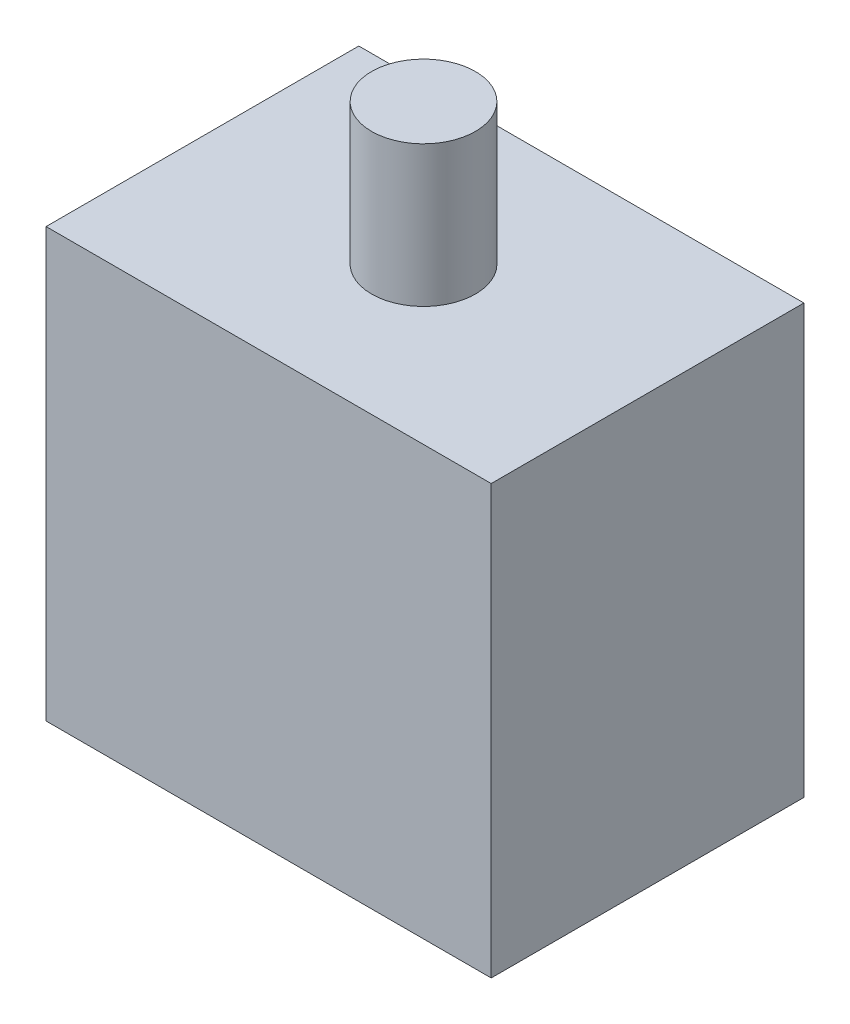
ISO-10303-21;
HEADER;
FILE_DESCRIPTION(('STEP AP214'),'2;1');
FILE_NAME('part.step','',(''),(''),'','','');
FILE_SCHEMA(('AUTOMOTIVE_DESIGN { 1 0 10303 214 1 1 1 1 }'));
ENDSEC;
DATA;
#1=APPLICATION_CONTEXT('core data for automotive mechanical design processes');
#2=APPLICATION_PROTOCOL_DEFINITION('international standard','automotive_design',2000,#1);
#3=PRODUCT_CONTEXT('',#1,'mechanical');
#4=PRODUCT('Part','Part','',(#3));
#5=PRODUCT_RELATED_PRODUCT_CATEGORY('part','',(#4));
#6=PRODUCT_DEFINITION_FORMATION('','',#4);
#7=PRODUCT_DEFINITION_CONTEXT('part definition',#1,'design');
#8=PRODUCT_DEFINITION('design','',#6,#7);
#9=PRODUCT_DEFINITION_SHAPE('','',#8);
#10=(LENGTH_UNIT() NAMED_UNIT(*) SI_UNIT(.MILLI.,.METRE.));
#11=(NAMED_UNIT(*) PLANE_ANGLE_UNIT() SI_UNIT($,.RADIAN.));
#12=(NAMED_UNIT(*) SI_UNIT($,.STERADIAN.) SOLID_ANGLE_UNIT());
#13=UNCERTAINTY_MEASURE_WITH_UNIT(LENGTH_MEASURE(1.E-05),#10,'distance_accuracy_value','');
#14=(GEOMETRIC_REPRESENTATION_CONTEXT(3) GLOBAL_UNCERTAINTY_ASSIGNED_CONTEXT((#13)) GLOBAL_UNIT_ASSIGNED_CONTEXT((#10,
#11,#12)) REPRESENTATION_CONTEXT('',''));
#15=CARTESIAN_POINT('',(0.,0.,0.));
#16=DIRECTION('',(0.,0.,1.));
#17=DIRECTION('',(1.,0.,0.));
#18=AXIS2_PLACEMENT_3D('',#15,#16,#17);
#19=CARTESIAN_POINT('',(0.,77.216,0.));
#20=DIRECTION('',(-1.,0.,0.));
#21=DIRECTION('',(0.,0.,1.));
#22=AXIS2_PLACEMENT_3D('',#19,#20,#21);
#23=PLANE('',#22);
#24=DIRECTION('',(0.,0.,-1.));
#25=VECTOR('',#24,1.);
#26=CARTESIAN_POINT('',(0.,0.,0.));
#27=LINE('',#26,#25);
#28=CARTESIAN_POINT('',(0.,0.,0.));
#29=VERTEX_POINT('',#28);
#30=CARTESIAN_POINT('',(0.,0.,-56.388));
#31=VERTEX_POINT('',#30);
#32=EDGE_CURVE('E110',#29,#31,#27,.T.);
#33=ORIENTED_EDGE('',*,*,#32,.T.);
#34=DIRECTION('',(0.,-1.,0.));
#35=VECTOR('',#34,1.);
#36=CARTESIAN_POINT('',(0.,77.216,-56.388));
#37=LINE('',#36,#35);
#38=CARTESIAN_POINT('',(0.,77.216,-56.388));
#39=VERTEX_POINT('',#38);
#40=EDGE_CURVE('E42',#39,#31,#37,.T.);
#41=ORIENTED_EDGE('',*,*,#40,.F.);
#42=DIRECTION('',(0.,0.,-1.));
#43=VECTOR('',#42,1.);
#44=CARTESIAN_POINT('',(0.,77.216,0.));
#45=LINE('',#44,#43);
#46=CARTESIAN_POINT('',(0.,77.216,0.));
#47=VERTEX_POINT('',#46);
#48=EDGE_CURVE('E93',#47,#39,#45,.T.);
#49=ORIENTED_EDGE('',*,*,#48,.F.);
#50=DIRECTION('',(0.,-1.,0.));
#51=VECTOR('',#50,1.);
#52=CARTESIAN_POINT('',(0.,77.216,0.));
#53=LINE('',#52,#51);
#54=EDGE_CURVE('E106',#47,#29,#53,.T.);
#55=ORIENTED_EDGE('',*,*,#54,.T.);
#56=EDGE_LOOP('',(#33,#41,#49,#55));
#57=FACE_BOUND('',#56,.T.);
#58=ADVANCED_FACE('F39',(#57),#23,.F.);
#59=CARTESIAN_POINT('',(0.,77.216,-56.388));
#60=DIRECTION('',(0.,0.,1.));
#61=DIRECTION('',(1.,0.,0.));
#62=AXIS2_PLACEMENT_3D('',#59,#60,#61);
#63=PLANE('',#62);
#64=DIRECTION('',(-1.,0.,0.));
#65=VECTOR('',#64,1.);
#66=CARTESIAN_POINT('',(0.,0.,-56.388));
#67=LINE('',#66,#65);
#68=CARTESIAN_POINT('',(-80.264,0.,-56.388));
#69=VERTEX_POINT('',#68);
#70=EDGE_CURVE('E99',#31,#69,#67,.T.);
#71=ORIENTED_EDGE('',*,*,#70,.T.);
#72=DIRECTION('',(0.,-1.,0.));
#73=VECTOR('',#72,1.);
#74=CARTESIAN_POINT('',(-80.264,77.216,-56.388));
#75=LINE('',#74,#73);
#76=CARTESIAN_POINT('',(-80.264,77.216,-56.388));
#77=VERTEX_POINT('',#76);
#78=EDGE_CURVE('E97',#77,#69,#75,.T.);
#79=ORIENTED_EDGE('',*,*,#78,.F.);
#80=DIRECTION('',(-1.,0.,0.));
#81=VECTOR('',#80,1.);
#82=CARTESIAN_POINT('',(0.,77.216,-56.388));
#83=LINE('',#82,#81);
#84=EDGE_CURVE('E88',#39,#77,#83,.T.);
#85=ORIENTED_EDGE('',*,*,#84,.F.);
#86=ORIENTED_EDGE('',*,*,#40,.T.);
#87=EDGE_LOOP('',(#71,#79,#85,#86));
#88=FACE_BOUND('',#87,.T.);
#89=ADVANCED_FACE('F98',(#88),#63,.F.);
#90=CARTESIAN_POINT('',(-80.264,77.216,0.));
#91=DIRECTION('',(1.,0.,0.));
#92=DIRECTION('',(0.,0.,-1.));
#93=AXIS2_PLACEMENT_3D('',#90,#91,#92);
#94=PLANE('',#93);
#95=DIRECTION('',(0.,0.,1.));
#96=VECTOR('',#95,1.);
#97=CARTESIAN_POINT('',(-80.264,0.,0.));
#98=LINE('',#97,#96);
#99=CARTESIAN_POINT('',(-80.264,0.,0.));
#100=VERTEX_POINT('',#99);
#101=EDGE_CURVE('E74',#69,#100,#98,.T.);
#102=ORIENTED_EDGE('',*,*,#101,.T.);
#103=DIRECTION('',(0.,-1.,0.));
#104=VECTOR('',#103,1.);
#105=CARTESIAN_POINT('',(-80.264,77.216,0.));
#106=LINE('',#105,#104);
#107=CARTESIAN_POINT('',(-80.264,77.216,0.));
#108=VERTEX_POINT('',#107);
#109=EDGE_CURVE('E101',#108,#100,#106,.T.);
#110=ORIENTED_EDGE('',*,*,#109,.F.);
#111=DIRECTION('',(0.,0.,1.));
#112=VECTOR('',#111,1.);
#113=CARTESIAN_POINT('',(-80.264,77.216,0.));
#114=LINE('',#113,#112);
#115=EDGE_CURVE('E91',#77,#108,#114,.T.);
#116=ORIENTED_EDGE('',*,*,#115,.F.);
#117=ORIENTED_EDGE('',*,*,#78,.T.);
#118=EDGE_LOOP('',(#102,#110,#116,#117));
#119=FACE_BOUND('',#118,.T.);
#120=ADVANCED_FACE('F102',(#119),#94,.F.);
#121=CARTESIAN_POINT('',(0.,77.216,0.));
#122=DIRECTION('',(0.,0.,-1.));
#123=DIRECTION('',(-1.,0.,0.));
#124=AXIS2_PLACEMENT_3D('',#121,#122,#123);
#125=PLANE('',#124);
#126=DIRECTION('',(1.,0.,0.));
#127=VECTOR('',#126,1.);
#128=CARTESIAN_POINT('',(0.,0.,0.));
#129=LINE('',#128,#127);
#130=EDGE_CURVE('E80',#100,#29,#129,.T.);
#131=ORIENTED_EDGE('',*,*,#130,.T.);
#132=ORIENTED_EDGE('',*,*,#54,.F.);
#133=DIRECTION('',(1.,0.,0.));
#134=VECTOR('',#133,1.);
#135=CARTESIAN_POINT('',(0.,77.216,0.));
#136=LINE('',#135,#134);
#137=EDGE_CURVE('E57',#108,#47,#136,.T.);
#138=ORIENTED_EDGE('',*,*,#137,.F.);
#139=ORIENTED_EDGE('',*,*,#109,.T.);
#140=EDGE_LOOP('',(#131,#132,#138,#139));
#141=FACE_BOUND('',#140,.T.);
#142=ADVANCED_FACE('F124',(#141),#125,.F.);
#143=CARTESIAN_POINT('',(0.,77.216,0.));
#144=DIRECTION('',(0.,1.,0.));
#145=DIRECTION('',(0.,0.,1.));
#146=AXIS2_PLACEMENT_3D('',#143,#144,#145);
#147=PLANE('',#146);
#148=CARTESIAN_POINT('',(-40.3691636804276,77.216,-28.1643545399468));
#149=DIRECTION('',(0.,1.,0.));
#150=DIRECTION('',(0.,0.,1.));
#151=AXIS2_PLACEMENT_3D('',#148,#149,#150);
#152=CIRCLE('',#151,9.36139604120757);
#153=CARTESIAN_POINT('',(-40.3691636804276,77.216,-18.8029584987392));
#154=VERTEX_POINT('',#153);
#155=EDGE_CURVE('E11',#154,#154,#152,.T.);
#156=ORIENTED_EDGE('',*,*,#155,.F.);
#157=EDGE_LOOP('',(#156));
#158=FACE_BOUND('',#157,.T.);
#159=ORIENTED_EDGE('',*,*,#48,.T.);
#160=ORIENTED_EDGE('',*,*,#84,.T.);
#161=ORIENTED_EDGE('',*,*,#115,.T.);
#162=ORIENTED_EDGE('',*,*,#137,.T.);
#163=EDGE_LOOP('',(#159,#160,#161,#162));
#164=FACE_BOUND('',#163,.T.);
#165=ADVANCED_FACE('F89',(#158,#164),#147,.T.);
#166=CARTESIAN_POINT('',(0.,0.,0.));
#167=DIRECTION('',(0.,1.,0.));
#168=DIRECTION('',(0.,0.,1.));
#169=AXIS2_PLACEMENT_3D('',#166,#167,#168);
#170=PLANE('',#169);
#171=ORIENTED_EDGE('',*,*,#32,.F.);
#172=ORIENTED_EDGE('',*,*,#130,.F.);
#173=ORIENTED_EDGE('',*,*,#101,.F.);
#174=ORIENTED_EDGE('',*,*,#70,.F.);
#175=EDGE_LOOP('',(#171,#172,#173,#174));
#176=FACE_BOUND('',#175,.T.);
#177=ADVANCED_FACE('F127',(#176),#170,.F.);
#178=CARTESIAN_POINT('',(-40.3691636804276,102.616,-28.1643545399468));
#179=DIRECTION('',(0.,-1.,0.));
#180=DIRECTION('',(0.,0.,-1.));
#181=AXIS2_PLACEMENT_3D('',#178,#179,#180);
#182=CYLINDRICAL_SURFACE('',#181,9.36139604120757);
#183=CARTESIAN_POINT('',(-40.3691636804276,102.616,-28.1643545399468));
#184=DIRECTION('',(0.,1.,0.));
#185=DIRECTION('',(0.,0.,1.));
#186=AXIS2_PLACEMENT_3D('',#183,#184,#185);
#187=CIRCLE('',#186,9.36139604120757);
#188=CARTESIAN_POINT('',(-40.3691636804276,102.616,-18.8029584987392));
#189=VERTEX_POINT('',#188);
#190=EDGE_CURVE('E114',#189,#189,#187,.T.);
#191=ORIENTED_EDGE('',*,*,#190,.F.);
#192=EDGE_LOOP('',(#191));
#193=FACE_BOUND('',#192,.T.);
#194=ORIENTED_EDGE('',*,*,#155,.T.);
#195=EDGE_LOOP('',(#194));
#196=FACE_BOUND('',#195,.T.);
#197=ADVANCED_FACE('F137',(#193,#196),#182,.T.);
#198=CARTESIAN_POINT('',(-40.3691636804276,102.616,-28.1643545399468));
#199=DIRECTION('',(0.,1.,0.));
#200=DIRECTION('',(0.,0.,1.));
#201=AXIS2_PLACEMENT_3D('',#198,#199,#200);
#202=PLANE('',#201);
#203=ORIENTED_EDGE('',*,*,#190,.T.);
#204=EDGE_LOOP('',(#203));
#205=FACE_BOUND('',#204,.T.);
#206=ADVANCED_FACE('F135',(#205),#202,.T.);
#207=CLOSED_SHELL('',(#58,#89,#120,#142,#165,#177,#197,#206));
#208=MANIFOLD_SOLID_BREP('B2',#207);
#209=ADVANCED_BREP_SHAPE_REPRESENTATION('',(#18,#208),#14);
#210=SHAPE_DEFINITION_REPRESENTATION(#9,#209);
ENDSEC;
END-ISO-10303-21;
